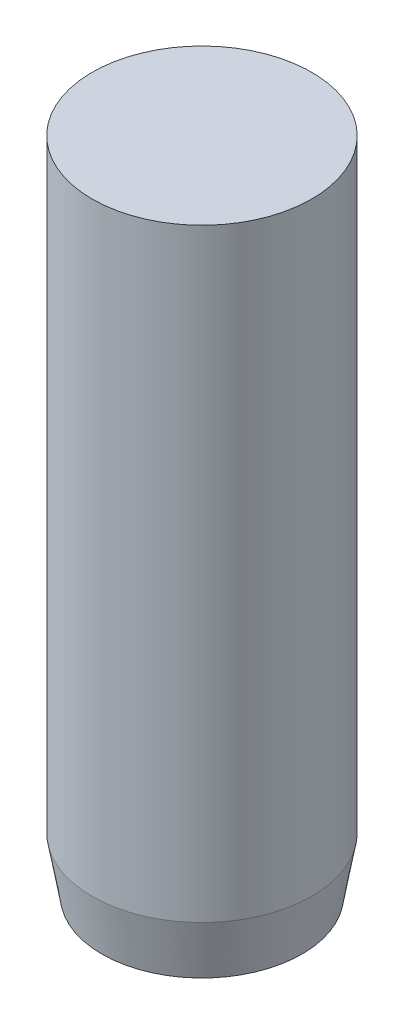
ISO-10303-21;
HEADER;
FILE_DESCRIPTION(('STEP AP214'),'2;1');
FILE_NAME('part.step','',(''),(''),'','','');
FILE_SCHEMA(('AUTOMOTIVE_DESIGN { 1 0 10303 214 1 1 1 1 }'));
ENDSEC;
DATA;
#1=APPLICATION_CONTEXT('core data for automotive mechanical design processes');
#2=APPLICATION_PROTOCOL_DEFINITION('international standard','automotive_design',2000,#1);
#3=PRODUCT_CONTEXT('',#1,'mechanical');
#4=PRODUCT('Part','Part','',(#3));
#5=PRODUCT_RELATED_PRODUCT_CATEGORY('part','',(#4));
#6=PRODUCT_DEFINITION_FORMATION('','',#4);
#7=PRODUCT_DEFINITION_CONTEXT('part definition',#1,'design');
#8=PRODUCT_DEFINITION('design','',#6,#7);
#9=PRODUCT_DEFINITION_SHAPE('','',#8);
#10=(LENGTH_UNIT() NAMED_UNIT(*) SI_UNIT(.MILLI.,.METRE.));
#11=(NAMED_UNIT(*) PLANE_ANGLE_UNIT() SI_UNIT($,.RADIAN.));
#12=(NAMED_UNIT(*) SI_UNIT($,.STERADIAN.) SOLID_ANGLE_UNIT());
#13=UNCERTAINTY_MEASURE_WITH_UNIT(LENGTH_MEASURE(1.E-05),#10,'distance_accuracy_value','');
#14=(GEOMETRIC_REPRESENTATION_CONTEXT(3) GLOBAL_UNCERTAINTY_ASSIGNED_CONTEXT((#13)) GLOBAL_UNIT_ASSIGNED_CONTEXT((#10,
#11,#12)) REPRESENTATION_CONTEXT('',''));
#15=CARTESIAN_POINT('',(0.,0.,0.));
#16=DIRECTION('',(0.,0.,1.));
#17=DIRECTION('',(1.,0.,0.));
#18=AXIS2_PLACEMENT_3D('',#15,#16,#17);
#19=CARTESIAN_POINT('',(0.,8.00000000000001,0.));
#20=DIRECTION('',(0.,-1.,0.));
#21=DIRECTION('',(0.,0.,-1.00000000000013));
#22=AXIS2_PLACEMENT_3D('',#19,#20,#21);
#23=CYLINDRICAL_SURFACE('',#22,2.);
#24=CARTESIAN_POINT('',(0.,8.00000000000001,0.));
#25=DIRECTION('',(0.,1.,0.));
#26=DIRECTION('',(0.,0.,1.00000000000013));
#27=AXIS2_PLACEMENT_3D('',#24,#25,#26);
#28=CIRCLE('',#27,2.);
#29=CARTESIAN_POINT('',(0.,8.00000000000001,2.00000000000024));
#30=VERTEX_POINT('',#29);
#31=EDGE_CURVE('E10',#30,#30,#28,.T.);
#32=ORIENTED_EDGE('',*,*,#31,.F.);
#33=EDGE_LOOP('',(#32));
#34=FACE_BOUND('',#33,.T.);
#35=CARTESIAN_POINT('',(0.,-3.,0.));
#36=DIRECTION('',(0.,1.,0.));
#37=DIRECTION('',(0.,0.,1.00000000000013));
#38=AXIS2_PLACEMENT_3D('',#35,#36,#37);
#39=CIRCLE('',#38,2.);
#40=CARTESIAN_POINT('',(0.,-3.,2.00000000000025));
#41=VERTEX_POINT('',#40);
#42=EDGE_CURVE('E51',#41,#41,#39,.T.);
#43=ORIENTED_EDGE('',*,*,#42,.T.);
#44=EDGE_LOOP('',(#43));
#45=FACE_BOUND('',#44,.T.);
#46=ADVANCED_FACE('F44',(#34,#45),#23,.T.);
#47=CARTESIAN_POINT('',(0.,8.00000000000001,0.));
#48=DIRECTION('',(0.,1.,0.));
#49=DIRECTION('',(0.,0.,1.00000000000013));
#50=AXIS2_PLACEMENT_3D('',#47,#48,#49);
#51=PLANE('',#50);
#52=ORIENTED_EDGE('',*,*,#31,.T.);
#53=EDGE_LOOP('',(#52));
#54=FACE_BOUND('',#53,.T.);
#55=ADVANCED_FACE('F76',(#54),#51,.T.);
#56=CARTESIAN_POINT('',(0.,-3.,0.));
#57=DIRECTION('',(0.,1.,0.));
#58=DIRECTION('',(0.,0.,1.00000000000013));
#59=AXIS2_PLACEMENT_3D('',#56,#57,#58);
#60=CONICAL_SURFACE('',#59,2.,0.174532925199426);
#61=CARTESIAN_POINT('',(0.,-3.99999999999999,0.));
#62=DIRECTION('',(0.,1.,0.));
#63=DIRECTION('',(0.,0.,1.00000000000013));
#64=AXIS2_PLACEMENT_3D('',#61,#62,#63);
#65=CIRCLE('',#64,1.82367301929154);
#66=CARTESIAN_POINT('',(0.,-3.99999999999999,1.82367301929177));
#67=VERTEX_POINT('',#66);
#68=EDGE_CURVE('E57',#67,#67,#65,.T.);
#69=ORIENTED_EDGE('',*,*,#68,.T.);
#70=EDGE_LOOP('',(#69));
#71=FACE_BOUND('',#70,.T.);
#72=ORIENTED_EDGE('',*,*,#42,.F.);
#73=EDGE_LOOP('',(#72));
#74=FACE_BOUND('',#73,.T.);
#75=ADVANCED_FACE('F67',(#71,#74),#60,.T.);
#76=CARTESIAN_POINT('',(0.,-4.,0.));
#77=DIRECTION('',(0.,1.,0.));
#78=DIRECTION('',(0.,0.,1.00000000000013));
#79=AXIS2_PLACEMENT_3D('',#76,#77,#78);
#80=PLANE('',#79);
#81=ORIENTED_EDGE('',*,*,#68,.F.);
#82=EDGE_LOOP('',(#81));
#83=FACE_BOUND('',#82,.T.);
#84=ADVANCED_FACE('F70',(#83),#80,.F.);
#85=CLOSED_SHELL('',(#46,#55,#75,#84));
#86=MANIFOLD_SOLID_BREP('B2',#85);
#87=ADVANCED_BREP_SHAPE_REPRESENTATION('',(#18,#86),#14);
#88=SHAPE_DEFINITION_REPRESENTATION(#9,#87);
ENDSEC;
END-ISO-10303-21;
